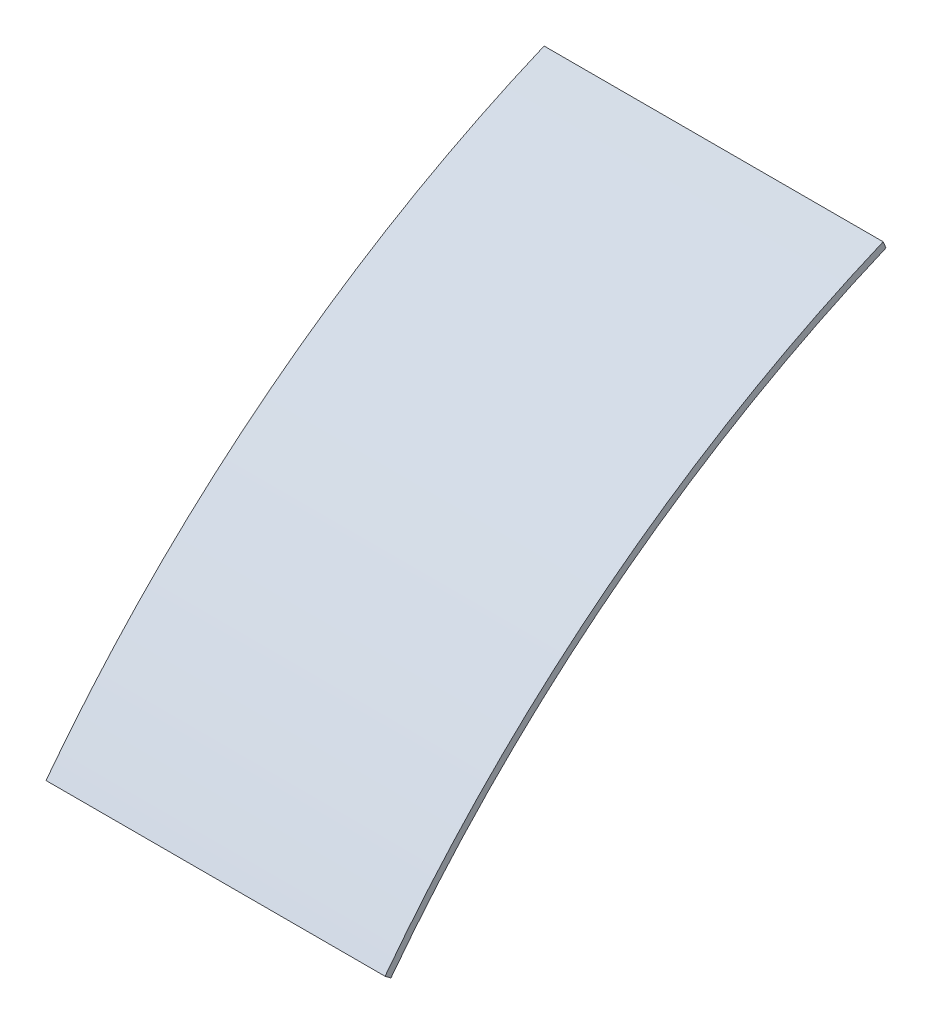
ISO-10303-21;
HEADER;
FILE_DESCRIPTION(('STEP AP214'),'2;1');
FILE_NAME('part.step','',(''),(''),'','','');
FILE_SCHEMA(('AUTOMOTIVE_DESIGN { 1 0 10303 214 1 1 1 1 }'));
ENDSEC;
DATA;
#1=APPLICATION_CONTEXT('core data for automotive mechanical design processes');
#2=APPLICATION_PROTOCOL_DEFINITION('international standard','automotive_design',2000,#1);
#3=PRODUCT_CONTEXT('',#1,'mechanical');
#4=PRODUCT('Part','Part','',(#3));
#5=PRODUCT_RELATED_PRODUCT_CATEGORY('part','',(#4));
#6=PRODUCT_DEFINITION_FORMATION('','',#4);
#7=PRODUCT_DEFINITION_CONTEXT('part definition',#1,'design');
#8=PRODUCT_DEFINITION('design','',#6,#7);
#9=PRODUCT_DEFINITION_SHAPE('','',#8);
#10=(LENGTH_UNIT() NAMED_UNIT(*) SI_UNIT(.MILLI.,.METRE.));
#11=(NAMED_UNIT(*) PLANE_ANGLE_UNIT() SI_UNIT($,.RADIAN.));
#12=(NAMED_UNIT(*) SI_UNIT($,.STERADIAN.) SOLID_ANGLE_UNIT());
#13=UNCERTAINTY_MEASURE_WITH_UNIT(LENGTH_MEASURE(1.E-05),#10,'distance_accuracy_value','');
#14=(GEOMETRIC_REPRESENTATION_CONTEXT(3) GLOBAL_UNCERTAINTY_ASSIGNED_CONTEXT((#13)) GLOBAL_UNIT_ASSIGNED_CONTEXT((#10,
#11,#12)) REPRESENTATION_CONTEXT('',''));
#15=CARTESIAN_POINT('',(0.,0.,0.));
#16=DIRECTION('',(0.,0.,1.));
#17=DIRECTION('',(1.,0.,0.));
#18=AXIS2_PLACEMENT_3D('',#15,#16,#17);
#19=CARTESIAN_POINT('',(146.2024,0.,0.));
#20=DIRECTION('',(0.,0.388415053767308,-0.921484533786074));
#21=DIRECTION('',(0.,0.921484533786075,0.388415053767308));
#22=AXIS2_PLACEMENT_3D('',#19,#20,#21);
#23=PLANE('',#22);
#24=DIRECTION('',(0.,-0.921484533786075,-0.388415053767308));
#25=VECTOR('',#24,1.);
#26=CARTESIAN_POINT('',(0.,0.,0.));
#27=LINE('',#26,#25);
#28=CARTESIAN_POINT('',(0.,0.,0.));
#29=VERTEX_POINT('',#28);
#30=CARTESIAN_POINT('',(0.,-2.92571341419413,-1.23321780389834));
#31=VERTEX_POINT('',#30);
#32=EDGE_CURVE('E101',#29,#31,#27,.T.);
#33=ORIENTED_EDGE('',*,*,#32,.F.);
#34=DIRECTION('',(-1.,0.,0.));
#35=VECTOR('',#34,1.);
#36=CARTESIAN_POINT('',(146.2024,0.,0.));
#37=LINE('',#36,#35);
#38=CARTESIAN_POINT('',(146.2024,0.,0.));
#39=VERTEX_POINT('',#38);
#40=EDGE_CURVE('E11',#39,#29,#37,.T.);
#41=ORIENTED_EDGE('',*,*,#40,.F.);
#42=DIRECTION('',(0.,-0.921484533786075,-0.388415053767308));
#43=VECTOR('',#42,1.);
#44=CARTESIAN_POINT('',(146.2024,0.,0.));
#45=LINE('',#44,#43);
#46=CARTESIAN_POINT('',(146.2024,-2.92571341419413,-1.23321780389834));
#47=VERTEX_POINT('',#46);
#48=EDGE_CURVE('E86',#39,#47,#45,.T.);
#49=ORIENTED_EDGE('',*,*,#48,.T.);
#50=DIRECTION('',(-1.,0.,0.));
#51=VECTOR('',#50,1.);
#52=CARTESIAN_POINT('',(146.2024,-2.92571341419413,-1.23321780389834));
#53=LINE('',#52,#51);
#54=EDGE_CURVE('E54',#47,#31,#53,.T.);
#55=ORIENTED_EDGE('',*,*,#54,.T.);
#56=EDGE_LOOP('',(#33,#41,#49,#55));
#57=FACE_BOUND('',#56,.T.);
#58=ADVANCED_FACE('F38',(#57),#23,.T.);
#59=CARTESIAN_POINT('',(146.2024,-484.26363175738,-204.056605382866));
#60=DIRECTION('',(-1.,0.,0.));
#61=DIRECTION('',(0.,0.,1.));
#62=AXIS2_PLACEMENT_3D('',#59,#60,#61);
#63=CYLINDRICAL_SURFACE('',#62,525.500107748032);
#64=CARTESIAN_POINT('',(0.,-484.26363175738,-204.056605382866));
#65=DIRECTION('',(1.,0.,0.));
#66=DIRECTION('',(0.,0.,-1.));
#67=AXIS2_PLACEMENT_3D('',#64,#65,#66);
#68=CIRCLE('',#67,525.500107748032);
#69=CARTESIAN_POINT('',(0.,-166.907181687235,214.793304300824));
#70=VERTEX_POINT('',#69);
#71=EDGE_CURVE('E92',#29,#70,#68,.T.);
#72=ORIENTED_EDGE('',*,*,#71,.T.);
#73=DIRECTION('',(-1.,0.,0.));
#74=VECTOR('',#73,1.);
#75=CARTESIAN_POINT('',(146.2024,-166.907181687235,214.793304300824));
#76=LINE('',#75,#74);
#77=CARTESIAN_POINT('',(146.2024,-166.907181687235,214.793304300824));
#78=VERTEX_POINT('',#77);
#79=EDGE_CURVE('E46',#78,#70,#76,.T.);
#80=ORIENTED_EDGE('',*,*,#79,.F.);
#81=CARTESIAN_POINT('',(146.2024,-484.26363175738,-204.056605382866));
#82=DIRECTION('',(1.,0.,0.));
#83=DIRECTION('',(0.,0.,-1.));
#84=AXIS2_PLACEMENT_3D('',#81,#82,#83);
#85=CIRCLE('',#84,525.500107748032);
#86=EDGE_CURVE('E80',#39,#78,#85,.T.);
#87=ORIENTED_EDGE('',*,*,#86,.F.);
#88=ORIENTED_EDGE('',*,*,#40,.T.);
#89=EDGE_LOOP('',(#72,#80,#87,#88));
#90=FACE_BOUND('',#89,.T.);
#91=ADVANCED_FACE('F90',(#90),#63,.T.);
#92=CARTESIAN_POINT('',(146.2024,-209.424828808494,158.678129541443));
#93=DIRECTION('',(0.,-0.797050092869913,0.603913196954714));
#94=DIRECTION('',(0.,-0.603913196954714,-0.797050092869913));
#95=AXIS2_PLACEMENT_3D('',#92,#93,#94);
#96=PLANE('',#95);
#97=DIRECTION('',(0.,0.603913196954714,0.797050092869913));
#98=VECTOR('',#97,1.);
#99=CARTESIAN_POINT('',(0.,-209.424828808494,158.678129541443));
#100=LINE('',#99,#98);
#101=CARTESIAN_POINT('',(0.,-168.824606087566,212.262670255962));
#102=VERTEX_POINT('',#101);
#103=EDGE_CURVE('E104',#102,#70,#100,.T.);
#104=ORIENTED_EDGE('',*,*,#103,.F.);
#105=DIRECTION('',(-1.,0.,0.));
#106=VECTOR('',#105,1.);
#107=CARTESIAN_POINT('',(146.2024,-168.824606087566,212.262670255962));
#108=LINE('',#107,#106);
#109=CARTESIAN_POINT('',(146.2024,-168.824606087566,212.262670255962));
#110=VERTEX_POINT('',#109);
#111=EDGE_CURVE('E67',#110,#102,#108,.T.);
#112=ORIENTED_EDGE('',*,*,#111,.F.);
#113=DIRECTION('',(0.,0.603913196954714,0.797050092869913));
#114=VECTOR('',#113,1.);
#115=CARTESIAN_POINT('',(146.2024,-209.424828808494,158.678129541443));
#116=LINE('',#115,#114);
#117=EDGE_CURVE('E85',#110,#78,#116,.T.);
#118=ORIENTED_EDGE('',*,*,#117,.T.);
#119=ORIENTED_EDGE('',*,*,#79,.T.);
#120=EDGE_LOOP('',(#104,#112,#118,#119));
#121=FACE_BOUND('',#120,.T.);
#122=ADVANCED_FACE('F95',(#121),#96,.T.);
#123=CARTESIAN_POINT('',(146.2024,-484.26363175738,-204.056605382866));
#124=DIRECTION('',(-1.,0.,0.));
#125=DIRECTION('',(0.,0.,1.));
#126=AXIS2_PLACEMENT_3D('',#123,#124,#125);
#127=CYLINDRICAL_SURFACE('',#126,522.325107748);
#128=CARTESIAN_POINT('',(0.,-484.26363175738,-204.056605382866));
#129=DIRECTION('',(1.,0.,0.));
#130=DIRECTION('',(0.,0.,-1.));
#131=AXIS2_PLACEMENT_3D('',#128,#129,#130);
#132=CIRCLE('',#131,522.325107748);
#133=EDGE_CURVE('E106',#31,#102,#132,.T.);
#134=ORIENTED_EDGE('',*,*,#133,.F.);
#135=ORIENTED_EDGE('',*,*,#54,.F.);
#136=CARTESIAN_POINT('',(146.2024,-484.26363175738,-204.056605382866));
#137=DIRECTION('',(1.,0.,0.));
#138=DIRECTION('',(0.,0.,-1.));
#139=AXIS2_PLACEMENT_3D('',#136,#137,#138);
#140=CIRCLE('',#139,522.325107748);
#141=EDGE_CURVE('E96',#47,#110,#140,.T.);
#142=ORIENTED_EDGE('',*,*,#141,.T.);
#143=ORIENTED_EDGE('',*,*,#111,.T.);
#144=EDGE_LOOP('',(#134,#135,#142,#143));
#145=FACE_BOUND('',#144,.T.);
#146=ADVANCED_FACE('F111',(#145),#127,.F.);
#147=CARTESIAN_POINT('',(146.2024,0.,0.));
#148=DIRECTION('',(1.,0.,0.));
#149=DIRECTION('',(0.,0.,-1.));
#150=AXIS2_PLACEMENT_3D('',#147,#148,#149);
#151=PLANE('',#150);
#152=ORIENTED_EDGE('',*,*,#48,.F.);
#153=ORIENTED_EDGE('',*,*,#86,.T.);
#154=ORIENTED_EDGE('',*,*,#117,.F.);
#155=ORIENTED_EDGE('',*,*,#141,.F.);
#156=EDGE_LOOP('',(#152,#153,#154,#155));
#157=FACE_BOUND('',#156,.T.);
#158=ADVANCED_FACE('F82',(#157),#151,.T.);
#159=CARTESIAN_POINT('',(0.,0.,0.));
#160=DIRECTION('',(1.,0.,0.));
#161=DIRECTION('',(0.,0.,-1.));
#162=AXIS2_PLACEMENT_3D('',#159,#160,#161);
#163=PLANE('',#162);
#164=ORIENTED_EDGE('',*,*,#32,.T.);
#165=ORIENTED_EDGE('',*,*,#133,.T.);
#166=ORIENTED_EDGE('',*,*,#103,.T.);
#167=ORIENTED_EDGE('',*,*,#71,.F.);
#168=EDGE_LOOP('',(#164,#165,#166,#167));
#169=FACE_BOUND('',#168,.T.);
#170=ADVANCED_FACE('F118',(#169),#163,.F.);
#171=CLOSED_SHELL('',(#58,#91,#122,#146,#158,#170));
#172=MANIFOLD_SOLID_BREP('B2',#171);
#173=ADVANCED_BREP_SHAPE_REPRESENTATION('',(#18,#172),#14);
#174=SHAPE_DEFINITION_REPRESENTATION(#9,#173);
ENDSEC;
END-ISO-10303-21;
